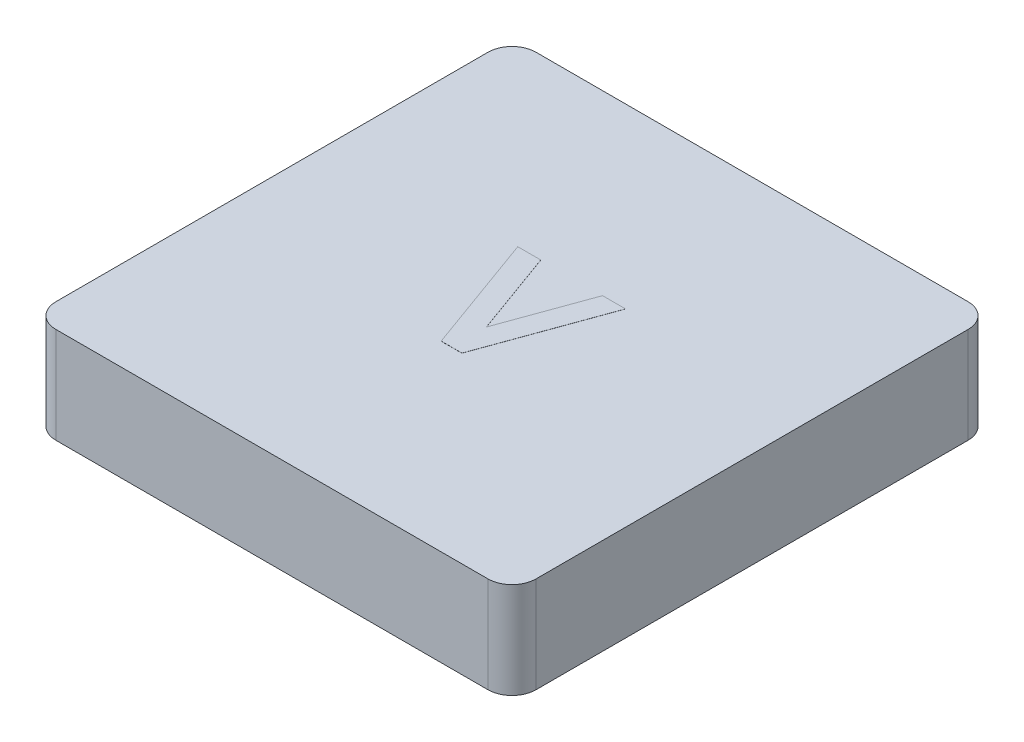
ISO-10303-21;
HEADER;
FILE_DESCRIPTION(('STEP AP214'),'2;1');
FILE_NAME('part.step','',(''),(''),'','','');
FILE_SCHEMA(('AUTOMOTIVE_DESIGN { 1 0 10303 214 1 1 1 1 }'));
ENDSEC;
DATA;
#1=APPLICATION_CONTEXT('core data for automotive mechanical design processes');
#2=APPLICATION_PROTOCOL_DEFINITION('international standard','automotive_design',2000,#1);
#3=PRODUCT_CONTEXT('',#1,'mechanical');
#4=PRODUCT('Part','Part','',(#3));
#5=PRODUCT_RELATED_PRODUCT_CATEGORY('part','',(#4));
#6=PRODUCT_DEFINITION_FORMATION('','',#4);
#7=PRODUCT_DEFINITION_CONTEXT('part definition',#1,'design');
#8=PRODUCT_DEFINITION('design','',#6,#7);
#9=PRODUCT_DEFINITION_SHAPE('','',#8);
#10=(LENGTH_UNIT() NAMED_UNIT(*) SI_UNIT(.MILLI.,.METRE.));
#11=(NAMED_UNIT(*) PLANE_ANGLE_UNIT() SI_UNIT($,.RADIAN.));
#12=(NAMED_UNIT(*) SI_UNIT($,.STERADIAN.) SOLID_ANGLE_UNIT());
#13=UNCERTAINTY_MEASURE_WITH_UNIT(LENGTH_MEASURE(1.E-05),#10,'distance_accuracy_value','');
#14=(GEOMETRIC_REPRESENTATION_CONTEXT(3) GLOBAL_UNCERTAINTY_ASSIGNED_CONTEXT((#13)) GLOBAL_UNIT_ASSIGNED_CONTEXT((#10,
#11,#12)) REPRESENTATION_CONTEXT('',''));
#15=CARTESIAN_POINT('',(0.,0.,0.));
#16=DIRECTION('',(0.,0.,1.));
#17=DIRECTION('',(1.,0.,0.));
#18=AXIS2_PLACEMENT_3D('',#15,#16,#17);
#19=CARTESIAN_POINT('',(0.,2.54,-12.7));
#20=DIRECTION('',(1.,0.,0.));
#21=DIRECTION('',(0.,0.,-1.));
#22=AXIS2_PLACEMENT_3D('',#19,#20,#21);
#23=PLANE('',#22);
#24=DIRECTION('',(0.,0.,1.));
#25=VECTOR('',#24,1.);
#26=CARTESIAN_POINT('',(0.,2.54,-12.7));
#27=LINE('',#26,#25);
#28=CARTESIAN_POINT('',(0.,2.54,-12.065));
#29=VERTEX_POINT('',#28);
#30=CARTESIAN_POINT('',(0.,2.54,-0.635));
#31=VERTEX_POINT('',#30);
#32=EDGE_CURVE('E266',#29,#31,#27,.T.);
#33=ORIENTED_EDGE('',*,*,#32,.F.);
#34=DIRECTION('',(0.,-1.,0.));
#35=VECTOR('',#34,1.);
#36=CARTESIAN_POINT('',(0.,2.54,-12.065));
#37=LINE('',#36,#35);
#38=CARTESIAN_POINT('',(0.,0.,-12.065));
#39=VERTEX_POINT('',#38);
#40=EDGE_CURVE('E291',#29,#39,#37,.T.);
#41=ORIENTED_EDGE('',*,*,#40,.T.);
#42=DIRECTION('',(0.,0.,1.));
#43=VECTOR('',#42,1.);
#44=CARTESIAN_POINT('',(0.,0.,-12.7));
#45=LINE('',#44,#43);
#46=CARTESIAN_POINT('',(0.,0.,-0.635));
#47=VERTEX_POINT('',#46);
#48=EDGE_CURVE('E246',#39,#47,#45,.T.);
#49=ORIENTED_EDGE('',*,*,#48,.T.);
#50=DIRECTION('',(0.,-1.,0.));
#51=VECTOR('',#50,1.);
#52=CARTESIAN_POINT('',(0.,2.54,-0.635));
#53=LINE('',#52,#51);
#54=EDGE_CURVE('E279',#47,#31,#53,.F.);
#55=ORIENTED_EDGE('',*,*,#54,.T.);
#56=EDGE_LOOP('',(#33,#41,#49,#55));
#57=FACE_BOUND('',#56,.T.);
#58=ADVANCED_FACE('F33',(#57),#23,.F.);
#59=CARTESIAN_POINT('',(0.,2.54,0.));
#60=DIRECTION('',(0.,0.,-1.));
#61=DIRECTION('',(-1.,0.,0.));
#62=AXIS2_PLACEMENT_3D('',#59,#60,#61);
#63=PLANE('',#62);
#64=DIRECTION('',(1.,0.,0.));
#65=VECTOR('',#64,1.);
#66=CARTESIAN_POINT('',(0.,0.,0.));
#67=LINE('',#66,#65);
#68=CARTESIAN_POINT('',(0.635,0.,0.));
#69=VERTEX_POINT('',#68);
#70=CARTESIAN_POINT('',(12.065,0.,0.));
#71=VERTEX_POINT('',#70);
#72=EDGE_CURVE('E282',#69,#71,#67,.T.);
#73=ORIENTED_EDGE('',*,*,#72,.T.);
#74=DIRECTION('',(0.,-1.,0.));
#75=VECTOR('',#74,1.);
#76=CARTESIAN_POINT('',(12.065,2.54,0.));
#77=LINE('',#76,#75);
#78=CARTESIAN_POINT('',(12.065,2.54,0.));
#79=VERTEX_POINT('',#78);
#80=EDGE_CURVE('E41',#71,#79,#77,.F.);
#81=ORIENTED_EDGE('',*,*,#80,.T.);
#82=DIRECTION('',(1.,0.,0.));
#83=VECTOR('',#82,1.);
#84=CARTESIAN_POINT('',(0.,2.54,0.));
#85=LINE('',#84,#83);
#86=CARTESIAN_POINT('',(0.635,2.54,0.));
#87=VERTEX_POINT('',#86);
#88=EDGE_CURVE('E269',#87,#79,#85,.T.);
#89=ORIENTED_EDGE('',*,*,#88,.F.);
#90=DIRECTION('',(0.,-1.,0.));
#91=VECTOR('',#90,1.);
#92=CARTESIAN_POINT('',(0.635,2.54,0.));
#93=LINE('',#92,#91);
#94=EDGE_CURVE('E320',#87,#69,#93,.T.);
#95=ORIENTED_EDGE('',*,*,#94,.T.);
#96=EDGE_LOOP('',(#73,#81,#89,#95));
#97=FACE_BOUND('',#96,.T.);
#98=ADVANCED_FACE('F325',(#97),#63,.F.);
#99=CARTESIAN_POINT('',(12.7,2.54,0.));
#100=DIRECTION('',(-1.,0.,0.));
#101=DIRECTION('',(0.,0.,1.));
#102=AXIS2_PLACEMENT_3D('',#99,#100,#101);
#103=PLANE('',#102);
#104=DIRECTION('',(0.,0.,-1.));
#105=VECTOR('',#104,1.);
#106=CARTESIAN_POINT('',(12.7,0.,0.));
#107=LINE('',#106,#105);
#108=CARTESIAN_POINT('',(12.7,0.,-0.635));
#109=VERTEX_POINT('',#108);
#110=CARTESIAN_POINT('',(12.7,0.,-12.065));
#111=VERTEX_POINT('',#110);
#112=EDGE_CURVE('E285',#109,#111,#107,.T.);
#113=ORIENTED_EDGE('',*,*,#112,.T.);
#114=DIRECTION('',(0.,-1.,0.));
#115=VECTOR('',#114,1.);
#116=CARTESIAN_POINT('',(12.7,2.54,-12.065));
#117=LINE('',#116,#115);
#118=CARTESIAN_POINT('',(12.7,2.54,-12.065));
#119=VERTEX_POINT('',#118);
#120=EDGE_CURVE('E318',#111,#119,#117,.F.);
#121=ORIENTED_EDGE('',*,*,#120,.T.);
#122=DIRECTION('',(0.,0.,-1.));
#123=VECTOR('',#122,1.);
#124=CARTESIAN_POINT('',(12.7,2.54,0.));
#125=LINE('',#124,#123);
#126=CARTESIAN_POINT('',(12.7,2.54,-0.635));
#127=VERTEX_POINT('',#126);
#128=EDGE_CURVE('E273',#127,#119,#125,.T.);
#129=ORIENTED_EDGE('',*,*,#128,.F.);
#130=DIRECTION('',(0.,-1.,0.));
#131=VECTOR('',#130,1.);
#132=CARTESIAN_POINT('',(12.7,2.54,-0.635));
#133=LINE('',#132,#131);
#134=EDGE_CURVE('E315',#127,#109,#133,.T.);
#135=ORIENTED_EDGE('',*,*,#134,.T.);
#136=EDGE_LOOP('',(#113,#121,#129,#135));
#137=FACE_BOUND('',#136,.T.);
#138=ADVANCED_FACE('F338',(#137),#103,.F.);
#139=CARTESIAN_POINT('',(12.7,2.54,-12.7));
#140=DIRECTION('',(0.,0.,1.));
#141=DIRECTION('',(1.,0.,0.));
#142=AXIS2_PLACEMENT_3D('',#139,#140,#141);
#143=PLANE('',#142);
#144=DIRECTION('',(-1.,0.,0.));
#145=VECTOR('',#144,1.);
#146=CARTESIAN_POINT('',(12.7,0.,-12.7));
#147=LINE('',#146,#145);
#148=CARTESIAN_POINT('',(12.065,0.,-12.7));
#149=VERTEX_POINT('',#148);
#150=CARTESIAN_POINT('',(0.634999999999995,0.,-12.7));
#151=VERTEX_POINT('',#150);
#152=EDGE_CURVE('E270',#149,#151,#147,.T.);
#153=ORIENTED_EDGE('',*,*,#152,.T.);
#154=DIRECTION('',(0.,-1.,0.));
#155=VECTOR('',#154,1.);
#156=CARTESIAN_POINT('',(0.634999999999995,2.54,-12.7));
#157=LINE('',#156,#155);
#158=CARTESIAN_POINT('',(0.634999999999995,2.54,-12.7));
#159=VERTEX_POINT('',#158);
#160=EDGE_CURVE('E305',#151,#159,#157,.F.);
#161=ORIENTED_EDGE('',*,*,#160,.T.);
#162=DIRECTION('',(-1.,0.,0.));
#163=VECTOR('',#162,1.);
#164=CARTESIAN_POINT('',(12.7,2.54,-12.7));
#165=LINE('',#164,#163);
#166=CARTESIAN_POINT('',(12.065,2.54,-12.7));
#167=VERTEX_POINT('',#166);
#168=EDGE_CURVE('E276',#167,#159,#165,.T.);
#169=ORIENTED_EDGE('',*,*,#168,.F.);
#170=DIRECTION('',(0.,-1.,0.));
#171=VECTOR('',#170,1.);
#172=CARTESIAN_POINT('',(12.065,2.54,-12.7));
#173=LINE('',#172,#171);
#174=EDGE_CURVE('E302',#167,#149,#173,.T.);
#175=ORIENTED_EDGE('',*,*,#174,.T.);
#176=EDGE_LOOP('',(#153,#161,#169,#175));
#177=FACE_BOUND('',#176,.T.);
#178=ADVANCED_FACE('F350',(#177),#143,.F.);
#179=CARTESIAN_POINT('',(0.,2.54,0.));
#180=DIRECTION('',(0.,1.,0.));
#181=DIRECTION('',(0.,0.,1.));
#182=AXIS2_PLACEMENT_3D('',#179,#180,#181);
#183=PLANE('',#182);
#184=DIRECTION('',(-0.340366431597277,0.,-0.940292875779529));
#185=VECTOR('',#184,1.);
#186=CARTESIAN_POINT('',(6.00084667467948,2.54,-4.826));
#187=LINE('',#186,#185);
#188=CARTESIAN_POINT('',(6.00084667467948,2.54,-4.826));
#189=VERTEX_POINT('',#188);
#190=CARTESIAN_POINT('',(4.85156282051282,2.54,-8.001));
#191=VERTEX_POINT('',#190);
#192=EDGE_CURVE('E203',#189,#191,#187,.T.);
#193=ORIENTED_EDGE('',*,*,#192,.T.);
#194=DIRECTION('',(1.,0.,0.));
#195=VECTOR('',#194,1.);
#196=CARTESIAN_POINT('',(4.85156282051282,2.54,-8.001));
#197=LINE('',#196,#195);
#198=CARTESIAN_POINT('',(5.46023169070512,2.54,-8.001));
#199=VERTEX_POINT('',#198);
#200=EDGE_CURVE('E169',#191,#199,#197,.T.);
#201=ORIENTED_EDGE('',*,*,#200,.T.);
#202=DIRECTION('',(0.340230879436885,0.,0.94034193178737));
#203=VECTOR('',#202,1.);
#204=CARTESIAN_POINT('',(5.46023169070512,2.54,-8.001));
#205=LINE('',#204,#203);
#206=CARTESIAN_POINT('',(6.2762423076923,2.54,-5.74568149038461));
#207=VERTEX_POINT('',#206);
#208=EDGE_CURVE('E206',#199,#207,#205,.T.);
#209=ORIENTED_EDGE('',*,*,#208,.T.);
#210=DIRECTION('',(0.340934054581555,0.,-0.940087214266092));
#211=VECTOR('',#210,1.);
#212=CARTESIAN_POINT('',(6.2762423076923,2.54,-5.74568149038461));
#213=LINE('',#212,#211);
#214=CARTESIAN_POINT('',(7.0941609775641,2.54,-8.001));
#215=VERTEX_POINT('',#214);
#216=EDGE_CURVE('E208',#207,#215,#213,.T.);
#217=ORIENTED_EDGE('',*,*,#216,.T.);
#218=DIRECTION('',(1.,0.,0.));
#219=VECTOR('',#218,1.);
#220=CARTESIAN_POINT('',(7.0941609775641,2.54,-8.001));
#221=LINE('',#220,#219);
#222=CARTESIAN_POINT('',(7.70092179487179,2.54,-8.001));
#223=VERTEX_POINT('',#222);
#224=EDGE_CURVE('E210',#215,#223,#221,.T.);
#225=ORIENTED_EDGE('',*,*,#224,.T.);
#226=DIRECTION('',(-0.340865903167363,0.,0.940111927409656));
#227=VECTOR('',#226,1.);
#228=CARTESIAN_POINT('',(7.70092179487179,2.54,-8.001));
#229=LINE('',#228,#227);
#230=CARTESIAN_POINT('',(6.54972988782051,2.54,-4.826));
#231=VERTEX_POINT('',#230);
#232=EDGE_CURVE('E53',#223,#231,#229,.T.);
#233=ORIENTED_EDGE('',*,*,#232,.T.);
#234=DIRECTION('',(-1.,0.,0.));
#235=VECTOR('',#234,1.);
#236=CARTESIAN_POINT('',(6.54972988782051,2.54,-4.826));
#237=LINE('',#236,#235);
#238=EDGE_CURVE('E48',#231,#189,#237,.T.);
#239=ORIENTED_EDGE('',*,*,#238,.T.);
#240=EDGE_LOOP('',(#193,#201,#209,#217,#225,#233,#239));
#241=FACE_BOUND('',#240,.T.);
#242=ORIENTED_EDGE('',*,*,#168,.T.);
#243=CARTESIAN_POINT('',(0.634999999999995,2.54,-12.065));
#244=DIRECTION('',(0.,1.,0.));
#245=DIRECTION('',(0.,0.,1.));
#246=AXIS2_PLACEMENT_3D('',#243,#244,#245);
#247=CIRCLE('',#246,0.635);
#248=EDGE_CURVE('E313',#159,#29,#247,.T.);
#249=ORIENTED_EDGE('',*,*,#248,.T.);
#250=ORIENTED_EDGE('',*,*,#32,.T.);
#251=CARTESIAN_POINT('',(0.635,2.54,-0.635));
#252=DIRECTION('',(0.,1.,0.));
#253=DIRECTION('',(0.,0.,1.));
#254=AXIS2_PLACEMENT_3D('',#251,#252,#253);
#255=CIRCLE('',#254,0.635);
#256=EDGE_CURVE('E307',#31,#87,#255,.T.);
#257=ORIENTED_EDGE('',*,*,#256,.T.);
#258=ORIENTED_EDGE('',*,*,#88,.T.);
#259=CARTESIAN_POINT('',(12.065,2.54,-0.635));
#260=DIRECTION('',(0.,1.,0.));
#261=DIRECTION('',(0.,0.,1.));
#262=AXIS2_PLACEMENT_3D('',#259,#260,#261);
#263=CIRCLE('',#262,0.635);
#264=EDGE_CURVE('E309',#79,#127,#263,.T.);
#265=ORIENTED_EDGE('',*,*,#264,.T.);
#266=ORIENTED_EDGE('',*,*,#128,.T.);
#267=CARTESIAN_POINT('',(12.065,2.54,-12.065));
#268=DIRECTION('',(0.,1.,0.));
#269=DIRECTION('',(0.,0.,1.));
#270=AXIS2_PLACEMENT_3D('',#267,#268,#269);
#271=CIRCLE('',#270,0.635);
#272=EDGE_CURVE('E311',#119,#167,#271,.T.);
#273=ORIENTED_EDGE('',*,*,#272,.T.);
#274=EDGE_LOOP('',(#242,#249,#250,#257,#258,#265,#266,#273));
#275=FACE_BOUND('',#274,.T.);
#276=ADVANCED_FACE('F331',(#241,#275),#183,.T.);
#277=CARTESIAN_POINT('',(0.,0.,0.));
#278=DIRECTION('',(0.,1.,0.));
#279=DIRECTION('',(0.,0.,1.));
#280=AXIS2_PLACEMENT_3D('',#277,#278,#279);
#281=PLANE('',#280);
#282=DIRECTION('',(-1.,0.,0.));
#283=VECTOR('',#282,1.);
#284=CARTESIAN_POINT('',(12.7,0.,-12.065));
#285=LINE('',#284,#283);
#286=CARTESIAN_POINT('',(12.065,0.,-12.065));
#287=VERTEX_POINT('',#286);
#288=CARTESIAN_POINT('',(0.634999999999995,0.,-12.065));
#289=VERTEX_POINT('',#288);
#290=EDGE_CURVE('E234',#287,#289,#285,.T.);
#291=ORIENTED_EDGE('',*,*,#290,.T.);
#292=DIRECTION('',(0.,0.,1.));
#293=VECTOR('',#292,1.);
#294=CARTESIAN_POINT('',(0.634999999999995,0.,-12.7));
#295=LINE('',#294,#293);
#296=CARTESIAN_POINT('',(0.635,0.,-0.635));
#297=VERTEX_POINT('',#296);
#298=EDGE_CURVE('E229',#289,#297,#295,.T.);
#299=ORIENTED_EDGE('',*,*,#298,.T.);
#300=DIRECTION('',(1.,0.,0.));
#301=VECTOR('',#300,1.);
#302=CARTESIAN_POINT('',(0.,0.,-0.635));
#303=LINE('',#302,#301);
#304=CARTESIAN_POINT('',(12.065,0.,-0.635));
#305=VERTEX_POINT('',#304);
#306=EDGE_CURVE('E258',#297,#305,#303,.T.);
#307=ORIENTED_EDGE('',*,*,#306,.T.);
#308=DIRECTION('',(0.,0.,-1.));
#309=VECTOR('',#308,1.);
#310=CARTESIAN_POINT('',(12.065,0.,0.));
#311=LINE('',#310,#309);
#312=EDGE_CURVE('E261',#305,#287,#311,.T.);
#313=ORIENTED_EDGE('',*,*,#312,.T.);
#314=EDGE_LOOP('',(#291,#299,#307,#313));
#315=FACE_BOUND('',#314,.T.);
#316=ORIENTED_EDGE('',*,*,#48,.F.);
#317=CARTESIAN_POINT('',(0.634999999999995,0.,-12.065));
#318=DIRECTION('',(0.,1.,0.));
#319=DIRECTION('',(0.,0.,1.));
#320=AXIS2_PLACEMENT_3D('',#317,#318,#319);
#321=CIRCLE('',#320,0.635);
#322=EDGE_CURVE('E300',#39,#151,#321,.F.);
#323=ORIENTED_EDGE('',*,*,#322,.T.);
#324=ORIENTED_EDGE('',*,*,#152,.F.);
#325=CARTESIAN_POINT('',(12.065,0.,-12.065));
#326=DIRECTION('',(0.,1.,0.));
#327=DIRECTION('',(0.,0.,1.));
#328=AXIS2_PLACEMENT_3D('',#325,#326,#327);
#329=CIRCLE('',#328,0.635);
#330=EDGE_CURVE('E298',#149,#111,#329,.F.);
#331=ORIENTED_EDGE('',*,*,#330,.T.);
#332=ORIENTED_EDGE('',*,*,#112,.F.);
#333=CARTESIAN_POINT('',(12.065,0.,-0.635));
#334=DIRECTION('',(0.,1.,0.));
#335=DIRECTION('',(0.,0.,1.));
#336=AXIS2_PLACEMENT_3D('',#333,#334,#335);
#337=CIRCLE('',#336,0.635);
#338=EDGE_CURVE('E296',#109,#71,#337,.F.);
#339=ORIENTED_EDGE('',*,*,#338,.T.);
#340=ORIENTED_EDGE('',*,*,#72,.F.);
#341=CARTESIAN_POINT('',(0.635,0.,-0.635));
#342=DIRECTION('',(0.,1.,0.));
#343=DIRECTION('',(0.,0.,1.));
#344=AXIS2_PLACEMENT_3D('',#341,#342,#343);
#345=CIRCLE('',#344,0.635);
#346=EDGE_CURVE('E294',#69,#47,#345,.F.);
#347=ORIENTED_EDGE('',*,*,#346,.T.);
#348=EDGE_LOOP('',(#316,#323,#324,#331,#332,#339,#340,#347));
#349=FACE_BOUND('',#348,.T.);
#350=ADVANCED_FACE('F342',(#315,#349),#281,.F.);
#351=CARTESIAN_POINT('',(0.634999999999995,2.54,-12.065));
#352=DIRECTION('',(0.,-1.,0.));
#353=DIRECTION('',(0.,0.,-1.));
#354=AXIS2_PLACEMENT_3D('',#351,#352,#353);
#355=CYLINDRICAL_SURFACE('',#354,0.635);
#356=ORIENTED_EDGE('',*,*,#248,.F.);
#357=ORIENTED_EDGE('',*,*,#160,.F.);
#358=ORIENTED_EDGE('',*,*,#322,.F.);
#359=ORIENTED_EDGE('',*,*,#40,.F.);
#360=EDGE_LOOP('',(#356,#357,#358,#359));
#361=FACE_BOUND('',#360,.T.);
#362=ADVANCED_FACE('F356',(#361),#355,.T.);
#363=CARTESIAN_POINT('',(12.065,2.54,-12.065));
#364=DIRECTION('',(0.,-1.,0.));
#365=DIRECTION('',(0.,0.,-1.));
#366=AXIS2_PLACEMENT_3D('',#363,#364,#365);
#367=CYLINDRICAL_SURFACE('',#366,0.635);
#368=ORIENTED_EDGE('',*,*,#272,.F.);
#369=ORIENTED_EDGE('',*,*,#120,.F.);
#370=ORIENTED_EDGE('',*,*,#330,.F.);
#371=ORIENTED_EDGE('',*,*,#174,.F.);
#372=EDGE_LOOP('',(#368,#369,#370,#371));
#373=FACE_BOUND('',#372,.T.);
#374=ADVANCED_FACE('F347',(#373),#367,.T.);
#375=CARTESIAN_POINT('',(12.065,2.54,-0.635));
#376=DIRECTION('',(0.,-1.,0.));
#377=DIRECTION('',(0.,0.,-1.));
#378=AXIS2_PLACEMENT_3D('',#375,#376,#377);
#379=CYLINDRICAL_SURFACE('',#378,0.635);
#380=ORIENTED_EDGE('',*,*,#264,.F.);
#381=ORIENTED_EDGE('',*,*,#80,.F.);
#382=ORIENTED_EDGE('',*,*,#338,.F.);
#383=ORIENTED_EDGE('',*,*,#134,.F.);
#384=EDGE_LOOP('',(#380,#381,#382,#383));
#385=FACE_BOUND('',#384,.T.);
#386=ADVANCED_FACE('F335',(#385),#379,.T.);
#387=CARTESIAN_POINT('',(0.635,2.54,-0.635));
#388=DIRECTION('',(0.,-1.,0.));
#389=DIRECTION('',(0.,0.,-1.));
#390=AXIS2_PLACEMENT_3D('',#387,#388,#389);
#391=CYLINDRICAL_SURFACE('',#390,0.635);
#392=ORIENTED_EDGE('',*,*,#256,.F.);
#393=ORIENTED_EDGE('',*,*,#54,.F.);
#394=ORIENTED_EDGE('',*,*,#346,.F.);
#395=ORIENTED_EDGE('',*,*,#94,.F.);
#396=EDGE_LOOP('',(#392,#393,#394,#395));
#397=FACE_BOUND('',#396,.T.);
#398=ADVANCED_FACE('F35',(#397),#391,.T.);
#399=CARTESIAN_POINT('',(0.634999999999995,2.54,-12.7));
#400=DIRECTION('',(1.,0.,0.));
#401=DIRECTION('',(0.,0.,-1.));
#402=AXIS2_PLACEMENT_3D('',#399,#400,#401);
#403=PLANE('',#402);
#404=DIRECTION('',(0.,0.,1.));
#405=VECTOR('',#404,1.);
#406=CARTESIAN_POINT('',(0.634999999999995,1.905,-12.7));
#407=LINE('',#406,#405);
#408=CARTESIAN_POINT('',(0.634999999999995,1.905,-12.065));
#409=VERTEX_POINT('',#408);
#410=CARTESIAN_POINT('',(0.635,1.905,-0.635));
#411=VERTEX_POINT('',#410);
#412=EDGE_CURVE('E230',#409,#411,#407,.T.);
#413=ORIENTED_EDGE('',*,*,#412,.T.);
#414=DIRECTION('',(0.,1.,0.));
#415=VECTOR('',#414,1.);
#416=CARTESIAN_POINT('',(0.635,2.54,-0.635));
#417=LINE('',#416,#415);
#418=EDGE_CURVE('E239',#297,#411,#417,.T.);
#419=ORIENTED_EDGE('',*,*,#418,.F.);
#420=ORIENTED_EDGE('',*,*,#298,.F.);
#421=DIRECTION('',(0.,1.,0.));
#422=VECTOR('',#421,1.);
#423=CARTESIAN_POINT('',(0.634999999999995,2.54,-12.065));
#424=LINE('',#423,#422);
#425=EDGE_CURVE('E235',#289,#409,#424,.T.);
#426=ORIENTED_EDGE('',*,*,#425,.T.);
#427=EDGE_LOOP('',(#413,#419,#420,#426));
#428=FACE_BOUND('',#427,.T.);
#429=ADVANCED_FACE('F361',(#428),#403,.T.);
#430=CARTESIAN_POINT('',(0.,2.54,-0.635));
#431=DIRECTION('',(0.,0.,-1.));
#432=DIRECTION('',(-1.,0.,0.));
#433=AXIS2_PLACEMENT_3D('',#430,#431,#432);
#434=PLANE('',#433);
#435=ORIENTED_EDGE('',*,*,#306,.F.);
#436=ORIENTED_EDGE('',*,*,#418,.T.);
#437=DIRECTION('',(1.,0.,0.));
#438=VECTOR('',#437,1.);
#439=CARTESIAN_POINT('',(0.,1.905,-0.635));
#440=LINE('',#439,#438);
#441=CARTESIAN_POINT('',(12.065,1.905,-0.635));
#442=VERTEX_POINT('',#441);
#443=EDGE_CURVE('E233',#411,#442,#440,.T.);
#444=ORIENTED_EDGE('',*,*,#443,.T.);
#445=DIRECTION('',(0.,1.,0.));
#446=VECTOR('',#445,1.);
#447=CARTESIAN_POINT('',(12.065,2.54,-0.635));
#448=LINE('',#447,#446);
#449=EDGE_CURVE('E243',#305,#442,#448,.T.);
#450=ORIENTED_EDGE('',*,*,#449,.F.);
#451=EDGE_LOOP('',(#435,#436,#444,#450));
#452=FACE_BOUND('',#451,.T.);
#453=ADVANCED_FACE('F366',(#452),#434,.T.);
#454=CARTESIAN_POINT('',(12.065,2.54,0.));
#455=DIRECTION('',(-1.,0.,0.));
#456=DIRECTION('',(0.,0.,1.));
#457=AXIS2_PLACEMENT_3D('',#454,#455,#456);
#458=PLANE('',#457);
#459=ORIENTED_EDGE('',*,*,#312,.F.);
#460=ORIENTED_EDGE('',*,*,#449,.T.);
#461=DIRECTION('',(0.,0.,-1.));
#462=VECTOR('',#461,1.);
#463=CARTESIAN_POINT('',(12.065,1.905,0.));
#464=LINE('',#463,#462);
#465=CARTESIAN_POINT('',(12.065,1.905,-12.065));
#466=VERTEX_POINT('',#465);
#467=EDGE_CURVE('E249',#442,#466,#464,.T.);
#468=ORIENTED_EDGE('',*,*,#467,.T.);
#469=DIRECTION('',(0.,1.,0.));
#470=VECTOR('',#469,1.);
#471=CARTESIAN_POINT('',(12.065,2.54,-12.065));
#472=LINE('',#471,#470);
#473=EDGE_CURVE('E238',#287,#466,#472,.T.);
#474=ORIENTED_EDGE('',*,*,#473,.F.);
#475=EDGE_LOOP('',(#459,#460,#468,#474));
#476=FACE_BOUND('',#475,.T.);
#477=ADVANCED_FACE('F419',(#476),#458,.T.);
#478=CARTESIAN_POINT('',(12.7,2.54,-12.065));
#479=DIRECTION('',(0.,0.,1.));
#480=DIRECTION('',(1.,0.,0.));
#481=AXIS2_PLACEMENT_3D('',#478,#479,#480);
#482=PLANE('',#481);
#483=ORIENTED_EDGE('',*,*,#290,.F.);
#484=ORIENTED_EDGE('',*,*,#473,.T.);
#485=DIRECTION('',(-1.,0.,0.));
#486=VECTOR('',#485,1.);
#487=CARTESIAN_POINT('',(12.7,1.905,-12.065));
#488=LINE('',#487,#486);
#489=EDGE_CURVE('E242',#466,#409,#488,.T.);
#490=ORIENTED_EDGE('',*,*,#489,.T.);
#491=ORIENTED_EDGE('',*,*,#425,.F.);
#492=EDGE_LOOP('',(#483,#484,#490,#491));
#493=FACE_BOUND('',#492,.T.);
#494=ADVANCED_FACE('F429',(#493),#482,.T.);
#495=CARTESIAN_POINT('',(0.,1.905,0.));
#496=DIRECTION('',(0.,1.,0.));
#497=DIRECTION('',(0.,0.,1.));
#498=AXIS2_PLACEMENT_3D('',#495,#496,#497);
#499=PLANE('',#498);
#500=CARTESIAN_POINT('',(6.34999999999999,1.905,-6.35));
#501=DIRECTION('',(0.,1.,0.));
#502=DIRECTION('',(0.,0.,1.));
#503=AXIS2_PLACEMENT_3D('',#500,#501,#502);
#504=CIRCLE('',#503,2.54);
#505=CARTESIAN_POINT('',(6.34999999999999,1.905,-3.81));
#506=VERTEX_POINT('',#505);
#507=EDGE_CURVE('E11',#506,#506,#504,.F.);
#508=ORIENTED_EDGE('',*,*,#507,.F.);
#509=EDGE_LOOP('',(#508));
#510=FACE_BOUND('',#509,.T.);
#511=ORIENTED_EDGE('',*,*,#489,.F.);
#512=ORIENTED_EDGE('',*,*,#467,.F.);
#513=ORIENTED_EDGE('',*,*,#443,.F.);
#514=ORIENTED_EDGE('',*,*,#412,.F.);
#515=EDGE_LOOP('',(#511,#512,#513,#514));
#516=FACE_BOUND('',#515,.T.);
#517=ADVANCED_FACE('F439',(#510,#516),#499,.F.);
#518=CARTESIAN_POINT('',(6.34999999999999,-7.18420489685532,-6.35));
#519=DIRECTION('',(0.,1.,0.));
#520=DIRECTION('',(0.,0.,1.));
#521=AXIS2_PLACEMENT_3D('',#518,#519,#520);
#522=CYLINDRICAL_SURFACE('',#521,2.54);
#523=CARTESIAN_POINT('',(6.34999999999999,0.,-6.35));
#524=DIRECTION('',(0.,1.,0.));
#525=DIRECTION('',(0.,0.,1.));
#526=AXIS2_PLACEMENT_3D('',#523,#524,#525);
#527=CIRCLE('',#526,2.54);
#528=CARTESIAN_POINT('',(6.34999999999999,0.,-3.81));
#529=VERTEX_POINT('',#528);
#530=EDGE_CURVE('E214',#529,#529,#527,.T.);
#531=CARTESIAN_POINT('',(6.34999999999999,0.,-3.81));
#532=CARTESIAN_POINT('',(6.34999999999999,0.0198437499999991,-3.81));
#533=CARTESIAN_POINT('',(6.34999999999999,0.0396874999999989,-3.81));
#534=CARTESIAN_POINT('',(6.34999999999999,0.079374999999999,-3.81));
#535=CARTESIAN_POINT('',(6.34999999999999,0.0992187499999992,-3.81));
#536=CARTESIAN_POINT('',(6.34999999999999,0.138906249999999,-3.81));
#537=CARTESIAN_POINT('',(6.34999999999999,0.158749999999999,-3.81));
#538=CARTESIAN_POINT('',(6.34999999999999,0.198437499999999,-3.81));
#539=CARTESIAN_POINT('',(6.34999999999999,0.218281249999999,-3.81));
#540=CARTESIAN_POINT('',(6.34999999999999,0.25796875,-3.81));
#541=CARTESIAN_POINT('',(6.34999999999999,0.277812499999999,-3.81));
#542=CARTESIAN_POINT('',(6.34999999999999,0.317499999999999,-3.81));
#543=CARTESIAN_POINT('',(6.34999999999999,0.337343749999999,-3.81));
#544=CARTESIAN_POINT('',(6.34999999999999,0.377031249999999,-3.81));
#545=CARTESIAN_POINT('',(6.34999999999999,0.396874999999999,-3.81));
#546=CARTESIAN_POINT('',(6.34999999999999,0.436562499999999,-3.81));
#547=CARTESIAN_POINT('',(6.34999999999999,0.456406249999999,-3.81));
#548=CARTESIAN_POINT('',(6.34999999999999,0.496093749999999,-3.81));
#549=CARTESIAN_POINT('',(6.34999999999999,0.515937499999999,-3.81));
#550=CARTESIAN_POINT('',(6.34999999999999,0.555624999999999,-3.81));
#551=CARTESIAN_POINT('',(6.34999999999999,0.575468749999999,-3.81));
#552=CARTESIAN_POINT('',(6.34999999999999,0.615156249999999,-3.81));
#553=CARTESIAN_POINT('',(6.34999999999999,0.634999999999999,-3.81));
#554=CARTESIAN_POINT('',(6.34999999999999,0.674687499999998,-3.81));
#555=CARTESIAN_POINT('',(6.34999999999999,0.694531249999998,-3.81));
#556=CARTESIAN_POINT('',(6.34999999999999,0.734218749999998,-3.81));
#557=CARTESIAN_POINT('',(6.34999999999999,0.754062499999998,-3.81));
#558=CARTESIAN_POINT('',(6.34999999999999,0.793749999999998,-3.81));
#559=CARTESIAN_POINT('',(6.34999999999999,0.813593749999999,-3.81));
#560=CARTESIAN_POINT('',(6.34999999999999,0.853281249999999,-3.81));
#561=CARTESIAN_POINT('',(6.34999999999999,0.873124999999999,-3.81));
#562=CARTESIAN_POINT('',(6.34999999999999,0.912812499999999,-3.81));
#563=CARTESIAN_POINT('',(6.34999999999999,0.932656249999999,-3.81));
#564=CARTESIAN_POINT('',(6.34999999999999,0.972343749999998,-3.81));
#565=CARTESIAN_POINT('',(6.34999999999999,0.992187499999998,-3.81));
#566=CARTESIAN_POINT('',(6.34999999999999,1.031875,-3.81));
#567=CARTESIAN_POINT('',(6.34999999999999,1.05171875,-3.81));
#568=CARTESIAN_POINT('',(6.34999999999999,1.09140625,-3.81));
#569=CARTESIAN_POINT('',(6.34999999999999,1.11125,-3.81));
#570=CARTESIAN_POINT('',(6.34999999999999,1.1509375,-3.81));
#571=CARTESIAN_POINT('',(6.34999999999999,1.17078125,-3.81));
#572=CARTESIAN_POINT('',(6.34999999999999,1.21046875,-3.81));
#573=CARTESIAN_POINT('',(6.34999999999999,1.2303125,-3.81));
#574=CARTESIAN_POINT('',(6.34999999999999,1.27,-3.81));
#575=CARTESIAN_POINT('',(6.34999999999999,1.28984375,-3.81));
#576=CARTESIAN_POINT('',(6.34999999999999,1.32953125,-3.81));
#577=CARTESIAN_POINT('',(6.34999999999999,1.349375,-3.81));
#578=CARTESIAN_POINT('',(6.34999999999999,1.3890625,-3.81));
#579=CARTESIAN_POINT('',(6.34999999999999,1.40890625,-3.81));
#580=CARTESIAN_POINT('',(6.34999999999999,1.44859375,-3.81));
#581=CARTESIAN_POINT('',(6.34999999999999,1.4684375,-3.81));
#582=CARTESIAN_POINT('',(6.34999999999999,1.508125,-3.81));
#583=CARTESIAN_POINT('',(6.34999999999999,1.52796875,-3.81));
#584=CARTESIAN_POINT('',(6.34999999999999,1.56765625,-3.81));
#585=CARTESIAN_POINT('',(6.34999999999999,1.5875,-3.81));
#586=CARTESIAN_POINT('',(6.34999999999999,1.6271875,-3.81));
#587=CARTESIAN_POINT('',(6.34999999999999,1.64703125,-3.81));
#588=CARTESIAN_POINT('',(6.34999999999999,1.68671875,-3.81));
#589=CARTESIAN_POINT('',(6.34999999999999,1.7065625,-3.81));
#590=CARTESIAN_POINT('',(6.34999999999999,1.74625,-3.81));
#591=CARTESIAN_POINT('',(6.34999999999999,1.76609375,-3.81));
#592=CARTESIAN_POINT('',(6.34999999999999,1.80578125,-3.81));
#593=CARTESIAN_POINT('',(6.34999999999999,1.825625,-3.81));
#594=CARTESIAN_POINT('',(6.34999999999999,1.8653125,-3.81));
#595=CARTESIAN_POINT('',(6.34999999999999,1.88515625,-3.81));
#596=CARTESIAN_POINT('',(6.34999999999999,1.905,-3.81));
#597=B_SPLINE_CURVE_WITH_KNOTS('',3,(#531,#532,#533,#534,#535,#536,#537,#538,#539,#540,#541,
#542,#543,#544,#545,#546,#547,#548,#549,#550,#551,#552,#553,#554,#555,#556,#557,#558,#559,#560,
#561,#562,#563,#564,#565,#566,#567,#568,#569,#570,#571,#572,#573,#574,#575,#576,#577,#578,#579,
#580,#581,#582,#583,#584,#585,#586,#587,#588,#589,#590,#591,#592,#593,#594,#595,#596),
.UNSPECIFIED.,.F.,.F.,(4,2,2,2,2,2,2,2,2,2,2,2,2,2,2,2,2,2,2,2,2,2,2,2,2,2,2,2,2,2,2,2,4),(0.,
0.0595312499999997,0.1190625,0.17859375,0.238125,0.29765625,0.3571875,0.41671875,0.47625,
0.53578125,0.5953125,0.654843749999999,0.714374999999999,0.773906249999999,0.8334375,0.89296875,
0.952499999999999,1.01203125,1.0715625,1.13109375,1.190625,1.25015625,1.3096875,1.36921875,
1.42875,1.48828125,1.5478125,1.60734375,1.666875,1.72640625,1.7859375,1.84546875,1.905),.UNSPECIFIED.);
#598=EDGE_CURVE('BSEAM449',#529,#506,#597,.T.);
#599=ORIENTED_EDGE('',*,*,#530,.T.);
#600=ORIENTED_EDGE('',*,*,#507,.T.);
#601=ORIENTED_EDGE('',*,*,#598,.T.);
#602=ORIENTED_EDGE('',*,*,#598,.F.);
#603=EDGE_LOOP('',(#599,#601,#600,#602));
#604=FACE_BOUND('',#603,.T.);
#605=ADVANCED_FACE('F449',(#604),#522,.T.);
#606=CARTESIAN_POINT('',(0.,0.,0.));
#607=DIRECTION('',(0.,1.,0.));
#608=DIRECTION('',(0.,0.,1.));
#609=AXIS2_PLACEMENT_3D('',#606,#607,#608);
#610=PLANE('',#609);
#611=ORIENTED_EDGE('',*,*,#530,.F.);
#612=EDGE_LOOP('',(#611));
#613=FACE_BOUND('',#612,.T.);
#614=ADVANCED_FACE('F459',(#613),#610,.F.);
#615=CARTESIAN_POINT('',(6.00084667467948,2.54254,-4.826));
#616=DIRECTION('',(-0.940292875779529,0.,0.340366431597277));
#617=DIRECTION('',(0.340366431597277,0.,0.940292875779529));
#618=AXIS2_PLACEMENT_3D('',#615,#616,#617);
#619=PLANE('',#618);
#620=ORIENTED_EDGE('',*,*,#192,.F.);
#621=DIRECTION('',(0.,-1.,0.));
#622=VECTOR('',#621,1.);
#623=CARTESIAN_POINT('',(6.00084667467948,2.54254,-4.826));
#624=LINE('',#623,#622);
#625=CARTESIAN_POINT('',(6.00084667467948,2.54254,-4.826));
#626=VERTEX_POINT('',#625);
#627=EDGE_CURVE('E188',#626,#189,#624,.T.);
#628=ORIENTED_EDGE('',*,*,#627,.F.);
#629=DIRECTION('',(-0.340366431597277,0.,-0.940292875779529));
#630=VECTOR('',#629,1.);
#631=CARTESIAN_POINT('',(6.00084667467948,2.54254,-4.826));
#632=LINE('',#631,#630);
#633=CARTESIAN_POINT('',(4.85156282051282,2.54254,-8.001));
#634=VERTEX_POINT('',#633);
#635=EDGE_CURVE('E181',#626,#634,#632,.T.);
#636=ORIENTED_EDGE('',*,*,#635,.T.);
#637=DIRECTION('',(0.,-1.,0.));
#638=VECTOR('',#637,1.);
#639=CARTESIAN_POINT('',(4.85156282051282,2.54254,-8.001));
#640=LINE('',#639,#638);
#641=EDGE_CURVE('E164',#634,#191,#640,.T.);
#642=ORIENTED_EDGE('',*,*,#641,.T.);
#643=EDGE_LOOP('',(#620,#628,#636,#642));
#644=FACE_BOUND('',#643,.T.);
#645=ADVANCED_FACE('F187',(#644),#619,.T.);
#646=CARTESIAN_POINT('',(6.54972988782051,2.54254,-4.826));
#647=DIRECTION('',(0.,0.,1.));
#648=DIRECTION('',(1.,0.,0.));
#649=AXIS2_PLACEMENT_3D('',#646,#647,#648);
#650=PLANE('',#649);
#651=ORIENTED_EDGE('',*,*,#238,.F.);
#652=DIRECTION('',(0.,-1.,0.));
#653=VECTOR('',#652,1.);
#654=CARTESIAN_POINT('',(6.54972988782051,2.54254,-4.826));
#655=LINE('',#654,#653);
#656=CARTESIAN_POINT('',(6.54972988782051,2.54254,-4.826));
#657=VERTEX_POINT('',#656);
#658=EDGE_CURVE('E215',#657,#231,#655,.T.);
#659=ORIENTED_EDGE('',*,*,#658,.F.);
#660=DIRECTION('',(-1.,0.,0.));
#661=VECTOR('',#660,1.);
#662=CARTESIAN_POINT('',(6.54972988782051,2.54254,-4.826));
#663=LINE('',#662,#661);
#664=EDGE_CURVE('E174',#657,#626,#663,.T.);
#665=ORIENTED_EDGE('',*,*,#664,.T.);
#666=ORIENTED_EDGE('',*,*,#627,.T.);
#667=EDGE_LOOP('',(#651,#659,#665,#666));
#668=FACE_BOUND('',#667,.T.);
#669=ADVANCED_FACE('F486',(#668),#650,.T.);
#670=CARTESIAN_POINT('',(7.70092179487179,2.54254,-8.001));
#671=DIRECTION('',(0.940111927409656,0.,0.340865903167363));
#672=DIRECTION('',(0.340865903167363,0.,-0.940111927409656));
#673=AXIS2_PLACEMENT_3D('',#670,#671,#672);
#674=PLANE('',#673);
#675=ORIENTED_EDGE('',*,*,#232,.F.);
#676=DIRECTION('',(0.,-1.,0.));
#677=VECTOR('',#676,1.);
#678=CARTESIAN_POINT('',(7.70092179487179,2.54254,-8.001));
#679=LINE('',#678,#677);
#680=CARTESIAN_POINT('',(7.70092179487179,2.54254,-8.001));
#681=VERTEX_POINT('',#680);
#682=EDGE_CURVE('E217',#681,#223,#679,.T.);
#683=ORIENTED_EDGE('',*,*,#682,.F.);
#684=DIRECTION('',(-0.340865903167363,0.,0.940111927409656));
#685=VECTOR('',#684,1.);
#686=CARTESIAN_POINT('',(7.70092179487179,2.54254,-8.001));
#687=LINE('',#686,#685);
#688=EDGE_CURVE('E199',#681,#657,#687,.T.);
#689=ORIENTED_EDGE('',*,*,#688,.T.);
#690=ORIENTED_EDGE('',*,*,#658,.T.);
#691=EDGE_LOOP('',(#675,#683,#689,#690));
#692=FACE_BOUND('',#691,.T.);
#693=ADVANCED_FACE('F495',(#692),#674,.T.);
#694=CARTESIAN_POINT('',(7.0941609775641,2.54254,-8.001));
#695=DIRECTION('',(0.,0.,-1.));
#696=DIRECTION('',(-1.,0.,0.));
#697=AXIS2_PLACEMENT_3D('',#694,#695,#696);
#698=PLANE('',#697);
#699=ORIENTED_EDGE('',*,*,#224,.F.);
#700=DIRECTION('',(0.,-1.,0.));
#701=VECTOR('',#700,1.);
#702=CARTESIAN_POINT('',(7.0941609775641,2.54254,-8.001));
#703=LINE('',#702,#701);
#704=CARTESIAN_POINT('',(7.0941609775641,2.54254,-8.001));
#705=VERTEX_POINT('',#704);
#706=EDGE_CURVE('E220',#705,#215,#703,.T.);
#707=ORIENTED_EDGE('',*,*,#706,.F.);
#708=DIRECTION('',(1.,0.,0.));
#709=VECTOR('',#708,1.);
#710=CARTESIAN_POINT('',(7.0941609775641,2.54254,-8.001));
#711=LINE('',#710,#709);
#712=EDGE_CURVE('E196',#705,#681,#711,.T.);
#713=ORIENTED_EDGE('',*,*,#712,.T.);
#714=ORIENTED_EDGE('',*,*,#682,.T.);
#715=EDGE_LOOP('',(#699,#707,#713,#714));
#716=FACE_BOUND('',#715,.T.);
#717=ADVANCED_FACE('F505',(#716),#698,.T.);
#718=CARTESIAN_POINT('',(6.2762423076923,2.54254,-5.74568149038461));
#719=DIRECTION('',(-0.940087214266092,0.,-0.340934054581555));
#720=DIRECTION('',(-0.340934054581555,0.,0.940087214266092));
#721=AXIS2_PLACEMENT_3D('',#718,#719,#720);
#722=PLANE('',#721);
#723=ORIENTED_EDGE('',*,*,#216,.F.);
#724=DIRECTION('',(0.,-1.,0.));
#725=VECTOR('',#724,1.);
#726=CARTESIAN_POINT('',(6.2762423076923,2.54254,-5.74568149038461));
#727=LINE('',#726,#725);
#728=CARTESIAN_POINT('',(6.2762423076923,2.54254,-5.74568149038461));
#729=VERTEX_POINT('',#728);
#730=EDGE_CURVE('E223',#729,#207,#727,.T.);
#731=ORIENTED_EDGE('',*,*,#730,.F.);
#732=DIRECTION('',(0.340934054581555,0.,-0.940087214266092));
#733=VECTOR('',#732,1.);
#734=CARTESIAN_POINT('',(6.2762423076923,2.54254,-5.74568149038461));
#735=LINE('',#734,#733);
#736=EDGE_CURVE('E193',#729,#705,#735,.T.);
#737=ORIENTED_EDGE('',*,*,#736,.T.);
#738=ORIENTED_EDGE('',*,*,#706,.T.);
#739=EDGE_LOOP('',(#723,#731,#737,#738));
#740=FACE_BOUND('',#739,.T.);
#741=ADVANCED_FACE('F515',(#740),#722,.T.);
#742=CARTESIAN_POINT('',(5.46023169070512,2.54254,-8.001));
#743=DIRECTION('',(0.94034193178737,0.,-0.340230879436885));
#744=DIRECTION('',(-0.340230879436885,0.,-0.94034193178737));
#745=AXIS2_PLACEMENT_3D('',#742,#743,#744);
#746=PLANE('',#745);
#747=ORIENTED_EDGE('',*,*,#208,.F.);
#748=DIRECTION('',(0.,-1.,0.));
#749=VECTOR('',#748,1.);
#750=CARTESIAN_POINT('',(5.46023169070512,2.54254,-8.001));
#751=LINE('',#750,#749);
#752=CARTESIAN_POINT('',(5.46023169070512,2.54254,-8.001));
#753=VERTEX_POINT('',#752);
#754=EDGE_CURVE('E173',#753,#199,#751,.T.);
#755=ORIENTED_EDGE('',*,*,#754,.F.);
#756=DIRECTION('',(0.340230879436885,0.,0.94034193178737));
#757=VECTOR('',#756,1.);
#758=CARTESIAN_POINT('',(5.46023169070512,2.54254,-8.001));
#759=LINE('',#758,#757);
#760=EDGE_CURVE('E185',#753,#729,#759,.T.);
#761=ORIENTED_EDGE('',*,*,#760,.T.);
#762=ORIENTED_EDGE('',*,*,#730,.T.);
#763=EDGE_LOOP('',(#747,#755,#761,#762));
#764=FACE_BOUND('',#763,.T.);
#765=ADVANCED_FACE('F525',(#764),#746,.T.);
#766=CARTESIAN_POINT('',(4.85156282051282,2.54254,-8.001));
#767=DIRECTION('',(0.,0.,-1.));
#768=DIRECTION('',(-1.,0.,0.));
#769=AXIS2_PLACEMENT_3D('',#766,#767,#768);
#770=PLANE('',#769);
#771=ORIENTED_EDGE('',*,*,#200,.F.);
#772=ORIENTED_EDGE('',*,*,#641,.F.);
#773=DIRECTION('',(1.,0.,0.));
#774=VECTOR('',#773,1.);
#775=CARTESIAN_POINT('',(4.85156282051282,2.54254,-8.001));
#776=LINE('',#775,#774);
#777=EDGE_CURVE('E168',#634,#753,#776,.T.);
#778=ORIENTED_EDGE('',*,*,#777,.T.);
#779=ORIENTED_EDGE('',*,*,#754,.T.);
#780=EDGE_LOOP('',(#771,#772,#778,#779));
#781=FACE_BOUND('',#780,.T.);
#782=ADVANCED_FACE('F166',(#781),#770,.T.);
#783=CARTESIAN_POINT('',(0.,2.54254,0.));
#784=DIRECTION('',(0.,-1.,0.));
#785=DIRECTION('',(0.,0.,-1.));
#786=AXIS2_PLACEMENT_3D('',#783,#784,#785);
#787=PLANE('',#786);
#788=ORIENTED_EDGE('',*,*,#635,.F.);
#789=ORIENTED_EDGE('',*,*,#664,.F.);
#790=ORIENTED_EDGE('',*,*,#688,.F.);
#791=ORIENTED_EDGE('',*,*,#712,.F.);
#792=ORIENTED_EDGE('',*,*,#736,.F.);
#793=ORIENTED_EDGE('',*,*,#760,.F.);
#794=ORIENTED_EDGE('',*,*,#777,.F.);
#795=EDGE_LOOP('',(#788,#789,#790,#791,#792,#793,#794));
#796=FACE_BOUND('',#795,.T.);
#797=ADVANCED_FACE('F179',(#796),#787,.F.);
#798=CLOSED_SHELL('',(#58,#98,#138,#178,#276,#350,#362,#374,#386,#398,#429,#453,#477,#494,#517,
#605,#614,#645,#669,#693,#717,#741,#765,#782,#797));
#799=MANIFOLD_SOLID_BREP('B2',#798);
#800=ADVANCED_BREP_SHAPE_REPRESENTATION('',(#18,#799),#14);
#801=SHAPE_DEFINITION_REPRESENTATION(#9,#800);
ENDSEC;
END-ISO-10303-21;
